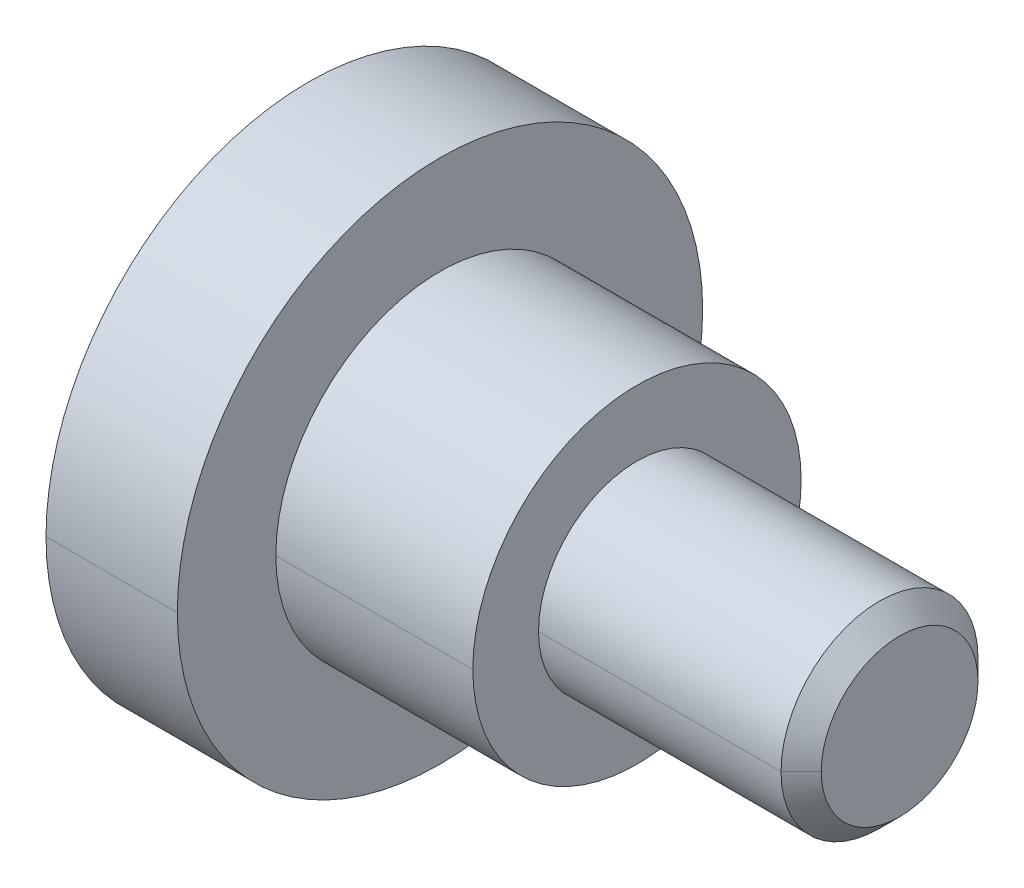
ISO-10303-21;
HEADER;
FILE_DESCRIPTION(('STEP AP214'),'2;1');
FILE_NAME('part.step','',(''),(''),'','','');
FILE_SCHEMA(('AUTOMOTIVE_DESIGN { 1 0 10303 214 1 1 1 1 }'));
ENDSEC;
DATA;
#1=APPLICATION_CONTEXT('core data for automotive mechanical design processes');
#2=APPLICATION_PROTOCOL_DEFINITION('international standard','automotive_design',2000,#1);
#3=PRODUCT_CONTEXT('',#1,'mechanical');
#4=PRODUCT('Part','Part','',(#3));
#5=PRODUCT_RELATED_PRODUCT_CATEGORY('part','',(#4));
#6=PRODUCT_DEFINITION_FORMATION('','',#4);
#7=PRODUCT_DEFINITION_CONTEXT('part definition',#1,'design');
#8=PRODUCT_DEFINITION('design','',#6,#7);
#9=PRODUCT_DEFINITION_SHAPE('','',#8);
#10=(LENGTH_UNIT() NAMED_UNIT(*) SI_UNIT(.MILLI.,.METRE.));
#11=(NAMED_UNIT(*) PLANE_ANGLE_UNIT() SI_UNIT($,.RADIAN.));
#12=(NAMED_UNIT(*) SI_UNIT($,.STERADIAN.) SOLID_ANGLE_UNIT());
#13=UNCERTAINTY_MEASURE_WITH_UNIT(LENGTH_MEASURE(1.E-05),#10,'distance_accuracy_value','');
#14=(GEOMETRIC_REPRESENTATION_CONTEXT(3) GLOBAL_UNCERTAINTY_ASSIGNED_CONTEXT((#13)) GLOBAL_UNIT_ASSIGNED_CONTEXT((#10,
#11,#12)) REPRESENTATION_CONTEXT('',''));
#15=CARTESIAN_POINT('',(0.,0.,0.));
#16=DIRECTION('',(0.,0.,1.));
#17=DIRECTION('',(1.,0.,0.));
#18=AXIS2_PLACEMENT_3D('',#15,#16,#17);
#19=CARTESIAN_POINT('',(-3.,0.,0.));
#20=DIRECTION('',(-1.,0.,0.));
#21=DIRECTION('',(0.,1.,0.));
#22=AXIS2_PLACEMENT_3D('',#19,#20,#21);
#23=CONICAL_SURFACE('',#22,1.,1.0471975512);
#24=DIRECTION('',(-0.499999999997054,0.,-0.86602540378614));
#25=VECTOR('',#24,1.);
#26=CARTESIAN_POINT('',(-2.42264973081491,0.,0.));
#27=LINE('',#26,#25);
#28=CARTESIAN_POINT('',(-2.4226497308104,0.,0.));
#29=VERTEX_POINT('',#28);
#30=CARTESIAN_POINT('',(-3.,0.,-1.));
#31=VERTEX_POINT('',#30);
#32=EDGE_CURVE('E11',#29,#31,#27,.T.);
#33=ORIENTED_EDGE('',*,*,#32,.T.);
#34=CARTESIAN_POINT('',(-3.,0.,0.));
#35=DIRECTION('',(-1.,0.,0.));
#36=DIRECTION('',(0.,0.,1.));
#37=AXIS2_PLACEMENT_3D('',#34,#35,#36);
#38=CIRCLE('',#37,1.);
#39=CARTESIAN_POINT('',(-3.,-0.866025403784422,-0.500000000000029));
#40=VERTEX_POINT('',#39);
#41=EDGE_CURVE('E24',#31,#40,#38,.T.);
#42=ORIENTED_EDGE('',*,*,#41,.T.);
#43=CARTESIAN_POINT('',(-3.,0.,0.));
#44=DIRECTION('',(-1.,0.,0.));
#45=DIRECTION('',(0.,0.,1.));
#46=AXIS2_PLACEMENT_3D('',#43,#44,#45);
#47=CIRCLE('',#46,1.);
#48=CARTESIAN_POINT('',(-3.,-0.866025403784422,0.500000000000029));
#49=VERTEX_POINT('',#48);
#50=EDGE_CURVE('E373',#40,#49,#47,.T.);
#51=ORIENTED_EDGE('',*,*,#50,.T.);
#52=CARTESIAN_POINT('',(-3.,0.,0.));
#53=DIRECTION('',(-1.,0.,0.));
#54=DIRECTION('',(0.,0.,1.));
#55=AXIS2_PLACEMENT_3D('',#52,#53,#54);
#56=CIRCLE('',#55,1.);
#57=CARTESIAN_POINT('',(-3.,0.,1.));
#58=VERTEX_POINT('',#57);
#59=EDGE_CURVE('E369',#49,#58,#56,.T.);
#60=ORIENTED_EDGE('',*,*,#59,.T.);
#61=DIRECTION('',(-0.499999999997054,0.,0.86602540378614));
#62=VECTOR('',#61,1.);
#63=CARTESIAN_POINT('',(-2.42264973081491,0.,0.));
#64=LINE('',#63,#62);
#65=EDGE_CURVE('E364',#29,#58,#64,.T.);
#66=ORIENTED_EDGE('',*,*,#65,.F.);
#67=EDGE_LOOP('',(#33,#42,#51,#60,#66));
#68=FACE_BOUND('',#67,.T.);
#69=ADVANCED_FACE('F16',(#68),#23,.F.);
#70=CARTESIAN_POINT('',(-3.,0.,0.));
#71=DIRECTION('',(-1.,0.,0.));
#72=DIRECTION('',(0.,-1.,0.));
#73=AXIS2_PLACEMENT_3D('',#70,#71,#72);
#74=CONICAL_SURFACE('',#73,1.,1.0471975512);
#75=ORIENTED_EDGE('',*,*,#65,.T.);
#76=CARTESIAN_POINT('',(-3.,0.,0.));
#77=DIRECTION('',(-1.,0.,0.));
#78=DIRECTION('',(0.,0.,1.));
#79=AXIS2_PLACEMENT_3D('',#76,#77,#78);
#80=CIRCLE('',#79,1.);
#81=CARTESIAN_POINT('',(-3.,0.866025403784422,0.500000000000029));
#82=VERTEX_POINT('',#81);
#83=EDGE_CURVE('E360',#58,#82,#80,.T.);
#84=ORIENTED_EDGE('',*,*,#83,.T.);
#85=CARTESIAN_POINT('',(-3.,0.,0.));
#86=DIRECTION('',(-1.,0.,0.));
#87=DIRECTION('',(0.,0.,1.));
#88=AXIS2_PLACEMENT_3D('',#85,#86,#87);
#89=CIRCLE('',#88,1.);
#90=CARTESIAN_POINT('',(-3.,0.866025403784422,-0.500000000000029));
#91=VERTEX_POINT('',#90);
#92=EDGE_CURVE('E356',#82,#91,#89,.T.);
#93=ORIENTED_EDGE('',*,*,#92,.T.);
#94=CARTESIAN_POINT('',(-3.,0.,0.));
#95=DIRECTION('',(-1.,0.,0.));
#96=DIRECTION('',(0.,0.,1.));
#97=AXIS2_PLACEMENT_3D('',#94,#95,#96);
#98=CIRCLE('',#97,1.);
#99=EDGE_CURVE('E352',#91,#31,#98,.T.);
#100=ORIENTED_EDGE('',*,*,#99,.T.);
#101=ORIENTED_EDGE('',*,*,#32,.F.);
#102=EDGE_LOOP('',(#75,#84,#93,#100,#101));
#103=FACE_BOUND('',#102,.T.);
#104=ADVANCED_FACE('F400',(#103),#74,.F.);
#105=CARTESIAN_POINT('',(-3.,0.,0.));
#106=DIRECTION('',(-1.,0.,0.));
#107=DIRECTION('',(0.,0.,1.));
#108=AXIS2_PLACEMENT_3D('',#105,#106,#107);
#109=PLANE('',#108);
#110=DIRECTION('',(0.,-1.,0.));
#111=VECTOR('',#110,1.);
#112=CARTESIAN_POINT('',(-3.,0.57735026918963,-1.));
#113=LINE('',#112,#111);
#114=CARTESIAN_POINT('',(-3.,0.57735026918963,-1.));
#115=VERTEX_POINT('',#114);
#116=EDGE_CURVE('E347',#115,#31,#113,.T.);
#117=ORIENTED_EDGE('',*,*,#116,.T.);
#118=ORIENTED_EDGE('',*,*,#99,.F.);
#119=DIRECTION('',(0.,-0.500000000000029,-0.866025403784422));
#120=VECTOR('',#119,1.);
#121=CARTESIAN_POINT('',(-3.,1.1547005383793,0.));
#122=LINE('',#121,#120);
#123=EDGE_CURVE('E343',#91,#115,#122,.T.);
#124=ORIENTED_EDGE('',*,*,#123,.T.);
#125=EDGE_LOOP('',(#117,#118,#124));
#126=FACE_BOUND('',#125,.T.);
#127=ADVANCED_FACE('F414',(#126),#109,.T.);
#128=CARTESIAN_POINT('',(-3.,1.1547005383793,0.));
#129=DIRECTION('',(0.,0.866025403784422,-0.500000000000029));
#130=DIRECTION('',(0.,0.500000000000029,0.866025403784422));
#131=AXIS2_PLACEMENT_3D('',#128,#129,#130);
#132=PLANE('',#131);
#133=DIRECTION('',(0.,-0.500000000000029,-0.866025403784422));
#134=VECTOR('',#133,1.);
#135=CARTESIAN_POINT('',(-5.,1.1547005383793,0.));
#136=LINE('',#135,#134);
#137=CARTESIAN_POINT('',(-5.,1.1547005383793,0.));
#138=VERTEX_POINT('',#137);
#139=CARTESIAN_POINT('',(-5.,0.57735026918963,-1.));
#140=VERTEX_POINT('',#139);
#141=EDGE_CURVE('E339',#138,#140,#136,.T.);
#142=ORIENTED_EDGE('',*,*,#141,.T.);
#143=DIRECTION('',(-1.,0.,0.));
#144=VECTOR('',#143,1.);
#145=CARTESIAN_POINT('',(-3.,0.57735026918963,-1.));
#146=LINE('',#145,#144);
#147=EDGE_CURVE('E334',#115,#140,#146,.T.);
#148=ORIENTED_EDGE('',*,*,#147,.F.);
#149=ORIENTED_EDGE('',*,*,#123,.F.);
#150=DIRECTION('',(0.,-0.500000000000029,-0.866025403784422));
#151=VECTOR('',#150,1.);
#152=CARTESIAN_POINT('',(-3.,1.1547005383793,0.));
#153=LINE('',#152,#151);
#154=CARTESIAN_POINT('',(-3.,1.1547005383793,0.));
#155=VERTEX_POINT('',#154);
#156=EDGE_CURVE('E329',#155,#91,#153,.T.);
#157=ORIENTED_EDGE('',*,*,#156,.F.);
#158=DIRECTION('',(-1.,0.,0.));
#159=VECTOR('',#158,1.);
#160=CARTESIAN_POINT('',(-3.,1.1547005383793,0.));
#161=LINE('',#160,#159);
#162=EDGE_CURVE('E325',#155,#138,#161,.T.);
#163=ORIENTED_EDGE('',*,*,#162,.T.);
#164=EDGE_LOOP('',(#142,#148,#149,#157,#163));
#165=FACE_BOUND('',#164,.T.);
#166=ADVANCED_FACE('F410',(#165),#132,.F.);
#167=CARTESIAN_POINT('',(-3.,0.57735026918963,1.));
#168=DIRECTION('',(0.,0.866025403784422,0.500000000000029));
#169=DIRECTION('',(0.,-0.500000000000029,0.866025403784422));
#170=AXIS2_PLACEMENT_3D('',#167,#168,#169);
#171=PLANE('',#170);
#172=DIRECTION('',(0.,0.500000000000029,-0.866025403784422));
#173=VECTOR('',#172,1.);
#174=CARTESIAN_POINT('',(-5.,0.57735026918963,1.));
#175=LINE('',#174,#173);
#176=CARTESIAN_POINT('',(-5.,0.57735026918963,1.));
#177=VERTEX_POINT('',#176);
#178=EDGE_CURVE('E320',#177,#138,#175,.T.);
#179=ORIENTED_EDGE('',*,*,#178,.T.);
#180=ORIENTED_EDGE('',*,*,#162,.F.);
#181=DIRECTION('',(0.,0.500000000000029,-0.866025403784422));
#182=VECTOR('',#181,1.);
#183=CARTESIAN_POINT('',(-3.,0.57735026918963,1.));
#184=LINE('',#183,#182);
#185=EDGE_CURVE('E315',#82,#155,#184,.T.);
#186=ORIENTED_EDGE('',*,*,#185,.F.);
#187=DIRECTION('',(0.,0.500000000000029,-0.866025403784422));
#188=VECTOR('',#187,1.);
#189=CARTESIAN_POINT('',(-3.,0.57735026918963,1.));
#190=LINE('',#189,#188);
#191=CARTESIAN_POINT('',(-3.,0.57735026918963,1.));
#192=VERTEX_POINT('',#191);
#193=EDGE_CURVE('E310',#192,#82,#190,.T.);
#194=ORIENTED_EDGE('',*,*,#193,.F.);
#195=DIRECTION('',(-1.,0.,0.));
#196=VECTOR('',#195,1.);
#197=CARTESIAN_POINT('',(-3.,0.57735026918963,1.));
#198=LINE('',#197,#196);
#199=EDGE_CURVE('E306',#192,#177,#198,.T.);
#200=ORIENTED_EDGE('',*,*,#199,.T.);
#201=EDGE_LOOP('',(#179,#180,#186,#194,#200));
#202=FACE_BOUND('',#201,.T.);
#203=ADVANCED_FACE('F404',(#202),#171,.F.);
#204=CARTESIAN_POINT('',(-3.,-0.57735026918963,1.));
#205=DIRECTION('',(0.,0.,1.));
#206=DIRECTION('',(1.,0.,0.));
#207=AXIS2_PLACEMENT_3D('',#204,#205,#206);
#208=PLANE('',#207);
#209=DIRECTION('',(0.,1.,0.));
#210=VECTOR('',#209,1.);
#211=CARTESIAN_POINT('',(-5.,-0.57735026918963,1.));
#212=LINE('',#211,#210);
#213=CARTESIAN_POINT('',(-5.,-0.57735026918963,1.));
#214=VERTEX_POINT('',#213);
#215=EDGE_CURVE('E301',#214,#177,#212,.T.);
#216=ORIENTED_EDGE('',*,*,#215,.T.);
#217=ORIENTED_EDGE('',*,*,#199,.F.);
#218=DIRECTION('',(0.,1.,0.));
#219=VECTOR('',#218,1.);
#220=CARTESIAN_POINT('',(-3.,-0.57735026918963,1.));
#221=LINE('',#220,#219);
#222=EDGE_CURVE('E296',#58,#192,#221,.T.);
#223=ORIENTED_EDGE('',*,*,#222,.F.);
#224=DIRECTION('',(0.,1.,0.));
#225=VECTOR('',#224,1.);
#226=CARTESIAN_POINT('',(-3.,-0.57735026918963,1.));
#227=LINE('',#226,#225);
#228=CARTESIAN_POINT('',(-3.,-0.57735026918963,1.));
#229=VERTEX_POINT('',#228);
#230=EDGE_CURVE('E291',#229,#58,#227,.T.);
#231=ORIENTED_EDGE('',*,*,#230,.F.);
#232=DIRECTION('',(-1.,0.,0.));
#233=VECTOR('',#232,1.);
#234=CARTESIAN_POINT('',(-3.,-0.57735026918963,1.));
#235=LINE('',#234,#233);
#236=EDGE_CURVE('E287',#229,#214,#235,.T.);
#237=ORIENTED_EDGE('',*,*,#236,.T.);
#238=EDGE_LOOP('',(#216,#217,#223,#231,#237));
#239=FACE_BOUND('',#238,.T.);
#240=ADVANCED_FACE('F430',(#239),#208,.F.);
#241=CARTESIAN_POINT('',(-3.,-1.1547005383793,0.));
#242=DIRECTION('',(0.,-0.866025403784422,0.500000000000029));
#243=DIRECTION('',(0.,-0.500000000000029,-0.866025403784422));
#244=AXIS2_PLACEMENT_3D('',#241,#242,#243);
#245=PLANE('',#244);
#246=DIRECTION('',(0.,0.500000000000029,0.866025403784422));
#247=VECTOR('',#246,1.);
#248=CARTESIAN_POINT('',(-5.,-1.1547005383793,0.));
#249=LINE('',#248,#247);
#250=CARTESIAN_POINT('',(-5.,-1.1547005383793,0.));
#251=VERTEX_POINT('',#250);
#252=EDGE_CURVE('E282',#251,#214,#249,.T.);
#253=ORIENTED_EDGE('',*,*,#252,.T.);
#254=ORIENTED_EDGE('',*,*,#236,.F.);
#255=DIRECTION('',(0.,0.500000000000029,0.866025403784422));
#256=VECTOR('',#255,1.);
#257=CARTESIAN_POINT('',(-3.,-1.1547005383793,0.));
#258=LINE('',#257,#256);
#259=EDGE_CURVE('E277',#49,#229,#258,.T.);
#260=ORIENTED_EDGE('',*,*,#259,.F.);
#261=DIRECTION('',(0.,0.500000000000029,0.866025403784422));
#262=VECTOR('',#261,1.);
#263=CARTESIAN_POINT('',(-3.,-1.1547005383793,0.));
#264=LINE('',#263,#262);
#265=CARTESIAN_POINT('',(-3.,-1.1547005383793,0.));
#266=VERTEX_POINT('',#265);
#267=EDGE_CURVE('E272',#266,#49,#264,.T.);
#268=ORIENTED_EDGE('',*,*,#267,.F.);
#269=DIRECTION('',(-1.,0.,0.));
#270=VECTOR('',#269,1.);
#271=CARTESIAN_POINT('',(-3.,-1.1547005383793,0.));
#272=LINE('',#271,#270);
#273=EDGE_CURVE('E268',#266,#251,#272,.T.);
#274=ORIENTED_EDGE('',*,*,#273,.T.);
#275=EDGE_LOOP('',(#253,#254,#260,#268,#274));
#276=FACE_BOUND('',#275,.T.);
#277=ADVANCED_FACE('F387',(#276),#245,.F.);
#278=CARTESIAN_POINT('',(-3.,-0.57735026918963,-1.));
#279=DIRECTION('',(0.,-0.866025403784422,-0.500000000000029));
#280=DIRECTION('',(0.,0.500000000000029,-0.866025403784422));
#281=AXIS2_PLACEMENT_3D('',#278,#279,#280);
#282=PLANE('',#281);
#283=DIRECTION('',(0.,-0.500000000000029,0.866025403784422));
#284=VECTOR('',#283,1.);
#285=CARTESIAN_POINT('',(-5.,-0.57735026918963,-1.));
#286=LINE('',#285,#284);
#287=CARTESIAN_POINT('',(-5.,-0.57735026918963,-1.));
#288=VERTEX_POINT('',#287);
#289=EDGE_CURVE('E263',#288,#251,#286,.T.);
#290=ORIENTED_EDGE('',*,*,#289,.T.);
#291=ORIENTED_EDGE('',*,*,#273,.F.);
#292=DIRECTION('',(0.,-0.500000000000029,0.866025403784422));
#293=VECTOR('',#292,1.);
#294=CARTESIAN_POINT('',(-3.,-0.57735026918963,-1.));
#295=LINE('',#294,#293);
#296=EDGE_CURVE('E258',#40,#266,#295,.T.);
#297=ORIENTED_EDGE('',*,*,#296,.F.);
#298=DIRECTION('',(0.,-0.500000000000029,0.866025403784422));
#299=VECTOR('',#298,1.);
#300=CARTESIAN_POINT('',(-3.,-0.57735026918963,-1.));
#301=LINE('',#300,#299);
#302=CARTESIAN_POINT('',(-3.,-0.57735026918963,-1.));
#303=VERTEX_POINT('',#302);
#304=EDGE_CURVE('E253',#303,#40,#301,.T.);
#305=ORIENTED_EDGE('',*,*,#304,.F.);
#306=DIRECTION('',(-1.,0.,0.));
#307=VECTOR('',#306,1.);
#308=CARTESIAN_POINT('',(-3.,-0.57735026918963,-1.));
#309=LINE('',#308,#307);
#310=EDGE_CURVE('E249',#303,#288,#309,.T.);
#311=ORIENTED_EDGE('',*,*,#310,.T.);
#312=EDGE_LOOP('',(#290,#291,#297,#305,#311));
#313=FACE_BOUND('',#312,.T.);
#314=ADVANCED_FACE('F422',(#313),#282,.F.);
#315=CARTESIAN_POINT('',(-3.,0.57735026918963,-1.));
#316=DIRECTION('',(0.,0.,-1.));
#317=DIRECTION('',(-1.,0.,0.));
#318=AXIS2_PLACEMENT_3D('',#315,#316,#317);
#319=PLANE('',#318);
#320=DIRECTION('',(0.,-1.,0.));
#321=VECTOR('',#320,1.);
#322=CARTESIAN_POINT('',(-5.,0.57735026918963,-1.));
#323=LINE('',#322,#321);
#324=EDGE_CURVE('E244',#140,#288,#323,.T.);
#325=ORIENTED_EDGE('',*,*,#324,.T.);
#326=ORIENTED_EDGE('',*,*,#310,.F.);
#327=DIRECTION('',(0.,-1.,0.));
#328=VECTOR('',#327,1.);
#329=CARTESIAN_POINT('',(-3.,0.57735026918963,-1.));
#330=LINE('',#329,#328);
#331=EDGE_CURVE('E239',#31,#303,#330,.T.);
#332=ORIENTED_EDGE('',*,*,#331,.F.);
#333=ORIENTED_EDGE('',*,*,#116,.F.);
#334=ORIENTED_EDGE('',*,*,#147,.T.);
#335=EDGE_LOOP('',(#325,#326,#332,#333,#334));
#336=FACE_BOUND('',#335,.T.);
#337=ADVANCED_FACE('F418',(#336),#319,.F.);
#338=CARTESIAN_POINT('',(-3.,0.,0.));
#339=DIRECTION('',(-1.,0.,0.));
#340=DIRECTION('',(0.,0.,1.));
#341=AXIS2_PLACEMENT_3D('',#338,#339,#340);
#342=PLANE('',#341);
#343=ORIENTED_EDGE('',*,*,#304,.T.);
#344=ORIENTED_EDGE('',*,*,#41,.F.);
#345=ORIENTED_EDGE('',*,*,#331,.T.);
#346=EDGE_LOOP('',(#343,#344,#345));
#347=FACE_BOUND('',#346,.T.);
#348=ADVANCED_FACE('F420',(#347),#342,.T.);
#349=CARTESIAN_POINT('',(-5.,0.,0.));
#350=DIRECTION('',(1.,0.,0.));
#351=DIRECTION('',(0.,0.,-1.));
#352=AXIS2_PLACEMENT_3D('',#349,#350,#351);
#353=PLANE('',#352);
#354=CARTESIAN_POINT('',(-5.,0.,0.));
#355=DIRECTION('',(1.,0.,0.));
#356=DIRECTION('',(0.,0.,-1.));
#357=AXIS2_PLACEMENT_3D('',#354,#355,#356);
#358=CIRCLE('',#357,4.);
#359=CARTESIAN_POINT('',(-5.,0.,-4.));
#360=VERTEX_POINT('',#359);
#361=CARTESIAN_POINT('',(-5.,0.,4.));
#362=VERTEX_POINT('',#361);
#363=EDGE_CURVE('E234',#360,#362,#358,.T.);
#364=ORIENTED_EDGE('',*,*,#363,.F.);
#365=CARTESIAN_POINT('',(-5.,0.,0.));
#366=DIRECTION('',(1.,0.,0.));
#367=DIRECTION('',(0.,0.,-1.));
#368=AXIS2_PLACEMENT_3D('',#365,#366,#367);
#369=CIRCLE('',#368,4.);
#370=EDGE_CURVE('E229',#362,#360,#369,.T.);
#371=ORIENTED_EDGE('',*,*,#370,.F.);
#372=EDGE_LOOP('',(#364,#371));
#373=FACE_BOUND('',#372,.T.);
#374=ORIENTED_EDGE('',*,*,#252,.F.);
#375=ORIENTED_EDGE('',*,*,#289,.F.);
#376=ORIENTED_EDGE('',*,*,#324,.F.);
#377=ORIENTED_EDGE('',*,*,#141,.F.);
#378=ORIENTED_EDGE('',*,*,#178,.F.);
#379=ORIENTED_EDGE('',*,*,#215,.F.);
#380=EDGE_LOOP('',(#374,#375,#376,#377,#378,#379));
#381=FACE_BOUND('',#380,.T.);
#382=ADVANCED_FACE('F428',(#373,#381),#353,.F.);
#383=CARTESIAN_POINT('',(4.,0.,0.));
#384=DIRECTION('',(-1.,0.,0.));
#385=DIRECTION('',(0.,1.,0.));
#386=AXIS2_PLACEMENT_3D('',#383,#384,#385);
#387=CYLINDRICAL_SURFACE('',#386,4.);
#388=ORIENTED_EDGE('',*,*,#370,.T.);
#389=DIRECTION('',(-1.,0.,0.));
#390=VECTOR('',#389,1.);
#391=CARTESIAN_POINT('',(-3.,0.,-4.));
#392=LINE('',#391,#390);
#393=CARTESIAN_POINT('',(-3.,0.,-4.));
#394=VERTEX_POINT('',#393);
#395=EDGE_CURVE('E224',#394,#360,#392,.T.);
#396=ORIENTED_EDGE('',*,*,#395,.F.);
#397=CARTESIAN_POINT('',(-3.,0.,0.));
#398=DIRECTION('',(1.,0.,0.));
#399=DIRECTION('',(0.,0.,-1.));
#400=AXIS2_PLACEMENT_3D('',#397,#398,#399);
#401=CIRCLE('',#400,4.);
#402=CARTESIAN_POINT('',(-3.,0.,4.));
#403=VERTEX_POINT('',#402);
#404=EDGE_CURVE('E219',#403,#394,#401,.T.);
#405=ORIENTED_EDGE('',*,*,#404,.F.);
#406=DIRECTION('',(-1.,0.,0.));
#407=VECTOR('',#406,1.);
#408=CARTESIAN_POINT('',(-3.,0.,4.));
#409=LINE('',#408,#407);
#410=EDGE_CURVE('E214',#403,#362,#409,.T.);
#411=ORIENTED_EDGE('',*,*,#410,.T.);
#412=EDGE_LOOP('',(#388,#396,#405,#411));
#413=FACE_BOUND('',#412,.T.);
#414=ADVANCED_FACE('F507',(#413),#387,.T.);
#415=CARTESIAN_POINT('',(4.,0.,0.));
#416=DIRECTION('',(-1.,0.,0.));
#417=DIRECTION('',(0.,-1.,0.));
#418=AXIS2_PLACEMENT_3D('',#415,#416,#417);
#419=CYLINDRICAL_SURFACE('',#418,4.);
#420=CARTESIAN_POINT('',(-3.,0.,0.));
#421=DIRECTION('',(1.,0.,0.));
#422=DIRECTION('',(0.,0.,-1.));
#423=AXIS2_PLACEMENT_3D('',#420,#421,#422);
#424=CIRCLE('',#423,4.);
#425=EDGE_CURVE('E209',#394,#403,#424,.T.);
#426=ORIENTED_EDGE('',*,*,#425,.F.);
#427=ORIENTED_EDGE('',*,*,#395,.T.);
#428=ORIENTED_EDGE('',*,*,#363,.T.);
#429=ORIENTED_EDGE('',*,*,#410,.F.);
#430=EDGE_LOOP('',(#426,#427,#428,#429));
#431=FACE_BOUND('',#430,.T.);
#432=ADVANCED_FACE('F517',(#431),#419,.T.);
#433=CARTESIAN_POINT('',(-3.,4.,0.));
#434=DIRECTION('',(-1.,0.,0.));
#435=DIRECTION('',(0.,0.,1.));
#436=AXIS2_PLACEMENT_3D('',#433,#434,#435);
#437=PLANE('',#436);
#438=CARTESIAN_POINT('',(-3.,0.,0.));
#439=DIRECTION('',(1.,0.,0.));
#440=DIRECTION('',(0.,0.,-1.));
#441=AXIS2_PLACEMENT_3D('',#438,#439,#440);
#442=CIRCLE('',#441,2.5);
#443=CARTESIAN_POINT('',(-3.,0.,-2.5));
#444=VERTEX_POINT('',#443);
#445=CARTESIAN_POINT('',(-3.,0.,2.5));
#446=VERTEX_POINT('',#445);
#447=EDGE_CURVE('E204',#444,#446,#442,.T.);
#448=ORIENTED_EDGE('',*,*,#447,.F.);
#449=CARTESIAN_POINT('',(-3.,0.,0.));
#450=DIRECTION('',(1.,0.,0.));
#451=DIRECTION('',(0.,0.,-1.));
#452=AXIS2_PLACEMENT_3D('',#449,#450,#451);
#453=CIRCLE('',#452,2.5);
#454=EDGE_CURVE('E199',#446,#444,#453,.T.);
#455=ORIENTED_EDGE('',*,*,#454,.F.);
#456=EDGE_LOOP('',(#448,#455));
#457=FACE_BOUND('',#456,.T.);
#458=ORIENTED_EDGE('',*,*,#425,.T.);
#459=ORIENTED_EDGE('',*,*,#404,.T.);
#460=EDGE_LOOP('',(#458,#459));
#461=FACE_BOUND('',#460,.T.);
#462=ADVANCED_FACE('F527',(#457,#461),#437,.F.);
#463=CARTESIAN_POINT('',(4.,0.,0.));
#464=DIRECTION('',(-1.,0.,0.));
#465=DIRECTION('',(0.,1.,0.));
#466=AXIS2_PLACEMENT_3D('',#463,#464,#465);
#467=CYLINDRICAL_SURFACE('',#466,2.5);
#468=ORIENTED_EDGE('',*,*,#454,.T.);
#469=DIRECTION('',(-1.,0.,0.));
#470=VECTOR('',#469,1.);
#471=CARTESIAN_POINT('',(0.,0.,-2.5));
#472=LINE('',#471,#470);
#473=CARTESIAN_POINT('',(0.,0.,-2.5));
#474=VERTEX_POINT('',#473);
#475=EDGE_CURVE('E194',#474,#444,#472,.T.);
#476=ORIENTED_EDGE('',*,*,#475,.F.);
#477=CARTESIAN_POINT('',(0.,0.,0.));
#478=DIRECTION('',(1.,0.,0.));
#479=DIRECTION('',(0.,0.,-1.));
#480=AXIS2_PLACEMENT_3D('',#477,#478,#479);
#481=CIRCLE('',#480,2.5);
#482=CARTESIAN_POINT('',(0.,0.,2.5));
#483=VERTEX_POINT('',#482);
#484=EDGE_CURVE('E189',#483,#474,#481,.T.);
#485=ORIENTED_EDGE('',*,*,#484,.F.);
#486=DIRECTION('',(-1.,0.,0.));
#487=VECTOR('',#486,1.);
#488=CARTESIAN_POINT('',(0.,0.,2.5));
#489=LINE('',#488,#487);
#490=EDGE_CURVE('E184',#483,#446,#489,.T.);
#491=ORIENTED_EDGE('',*,*,#490,.T.);
#492=EDGE_LOOP('',(#468,#476,#485,#491));
#493=FACE_BOUND('',#492,.T.);
#494=ADVANCED_FACE('F537',(#493),#467,.T.);
#495=CARTESIAN_POINT('',(4.,0.,0.));
#496=DIRECTION('',(-1.,0.,0.));
#497=DIRECTION('',(0.,-1.,0.));
#498=AXIS2_PLACEMENT_3D('',#495,#496,#497);
#499=CYLINDRICAL_SURFACE('',#498,2.5);
#500=CARTESIAN_POINT('',(0.,0.,0.));
#501=DIRECTION('',(1.,0.,0.));
#502=DIRECTION('',(0.,0.,-1.));
#503=AXIS2_PLACEMENT_3D('',#500,#501,#502);
#504=CIRCLE('',#503,2.5);
#505=EDGE_CURVE('E179',#474,#483,#504,.T.);
#506=ORIENTED_EDGE('',*,*,#505,.F.);
#507=ORIENTED_EDGE('',*,*,#475,.T.);
#508=ORIENTED_EDGE('',*,*,#447,.T.);
#509=ORIENTED_EDGE('',*,*,#490,.F.);
#510=EDGE_LOOP('',(#506,#507,#508,#509));
#511=FACE_BOUND('',#510,.T.);
#512=ADVANCED_FACE('F547',(#511),#499,.T.);
#513=CARTESIAN_POINT('',(0.,2.5,0.));
#514=DIRECTION('',(-1.,0.,0.));
#515=DIRECTION('',(0.,0.,1.));
#516=AXIS2_PLACEMENT_3D('',#513,#514,#515);
#517=PLANE('',#516);
#518=CARTESIAN_POINT('',(0.,0.,0.));
#519=DIRECTION('',(1.,0.,0.));
#520=DIRECTION('',(0.,0.,-1.));
#521=AXIS2_PLACEMENT_3D('',#518,#519,#520);
#522=CIRCLE('',#521,1.5);
#523=CARTESIAN_POINT('',(0.,0.,-1.5));
#524=VERTEX_POINT('',#523);
#525=CARTESIAN_POINT('',(0.,0.,1.5));
#526=VERTEX_POINT('',#525);
#527=EDGE_CURVE('E174',#524,#526,#522,.T.);
#528=ORIENTED_EDGE('',*,*,#527,.F.);
#529=CARTESIAN_POINT('',(0.,0.,0.));
#530=DIRECTION('',(1.,0.,0.));
#531=DIRECTION('',(0.,0.,-1.));
#532=AXIS2_PLACEMENT_3D('',#529,#530,#531);
#533=CIRCLE('',#532,1.5);
#534=EDGE_CURVE('E169',#526,#524,#533,.T.);
#535=ORIENTED_EDGE('',*,*,#534,.F.);
#536=EDGE_LOOP('',(#528,#535));
#537=FACE_BOUND('',#536,.T.);
#538=ORIENTED_EDGE('',*,*,#505,.T.);
#539=ORIENTED_EDGE('',*,*,#484,.T.);
#540=EDGE_LOOP('',(#538,#539));
#541=FACE_BOUND('',#540,.T.);
#542=ADVANCED_FACE('F557',(#537,#541),#517,.F.);
#543=CARTESIAN_POINT('',(4.,0.,0.));
#544=DIRECTION('',(-1.,0.,0.));
#545=DIRECTION('',(0.,1.,0.));
#546=AXIS2_PLACEMENT_3D('',#543,#544,#545);
#547=CYLINDRICAL_SURFACE('',#546,1.5);
#548=ORIENTED_EDGE('',*,*,#534,.T.);
#549=DIRECTION('',(-1.,0.,0.));
#550=VECTOR('',#549,1.);
#551=CARTESIAN_POINT('',(3.6935,0.,-1.5));
#552=LINE('',#551,#550);
#553=CARTESIAN_POINT('',(3.6935,0.,-1.5));
#554=VERTEX_POINT('',#553);
#555=EDGE_CURVE('E164',#554,#524,#552,.T.);
#556=ORIENTED_EDGE('',*,*,#555,.F.);
#557=CARTESIAN_POINT('',(3.6935,0.,0.));
#558=DIRECTION('',(1.,0.,0.));
#559=DIRECTION('',(0.,0.,-1.));
#560=AXIS2_PLACEMENT_3D('',#557,#558,#559);
#561=CIRCLE('',#560,1.5);
#562=CARTESIAN_POINT('',(3.6935,0.,1.5));
#563=VERTEX_POINT('',#562);
#564=EDGE_CURVE('E160',#563,#554,#561,.T.);
#565=ORIENTED_EDGE('',*,*,#564,.F.);
#566=DIRECTION('',(-1.,0.,0.));
#567=VECTOR('',#566,1.);
#568=CARTESIAN_POINT('',(3.6935,0.,1.5));
#569=LINE('',#568,#567);
#570=EDGE_CURVE('E148',#563,#526,#569,.T.);
#571=ORIENTED_EDGE('',*,*,#570,.T.);
#572=EDGE_LOOP('',(#548,#556,#565,#571));
#573=FACE_BOUND('',#572,.T.);
#574=ADVANCED_FACE('F567',(#573),#547,.T.);
#575=CARTESIAN_POINT('',(4.,0.,0.));
#576=DIRECTION('',(-1.,0.,0.));
#577=DIRECTION('',(0.,-1.,0.));
#578=AXIS2_PLACEMENT_3D('',#575,#576,#577);
#579=CYLINDRICAL_SURFACE('',#578,1.5);
#580=CARTESIAN_POINT('',(3.6935,0.,0.));
#581=DIRECTION('',(1.,0.,0.));
#582=DIRECTION('',(0.,0.,-1.));
#583=AXIS2_PLACEMENT_3D('',#580,#581,#582);
#584=CIRCLE('',#583,1.5);
#585=EDGE_CURVE('E136',#554,#563,#584,.T.);
#586=ORIENTED_EDGE('',*,*,#585,.F.);
#587=ORIENTED_EDGE('',*,*,#555,.T.);
#588=ORIENTED_EDGE('',*,*,#527,.T.);
#589=ORIENTED_EDGE('',*,*,#570,.F.);
#590=EDGE_LOOP('',(#586,#587,#588,#589));
#591=FACE_BOUND('',#590,.T.);
#592=ADVANCED_FACE('F577',(#591),#579,.T.);
#593=CARTESIAN_POINT('',(3.6935,0.,0.));
#594=DIRECTION('',(-1.,0.,0.));
#595=DIRECTION('',(0.,-1.,0.));
#596=AXIS2_PLACEMENT_3D('',#593,#594,#595);
#597=CONICAL_SURFACE('',#596,1.5,0.7853981634);
#598=CARTESIAN_POINT('',(4.,0.,0.));
#599=DIRECTION('',(1.,0.,0.));
#600=DIRECTION('',(0.,0.,-1.));
#601=AXIS2_PLACEMENT_3D('',#598,#599,#600);
#602=CIRCLE('',#601,1.1935);
#603=CARTESIAN_POINT('',(4.,0.,-1.1935));
#604=VERTEX_POINT('',#603);
#605=CARTESIAN_POINT('',(3.99999999999922,0.,1.19349999999922));
#606=VERTEX_POINT('',#605);
#607=EDGE_CURVE('E133',#604,#606,#602,.T.);
#608=ORIENTED_EDGE('',*,*,#607,.F.);
#609=DIRECTION('',(-0.707106781184743,0.,-0.707106781188352));
#610=VECTOR('',#609,1.);
#611=CARTESIAN_POINT('',(3.99999999999922,0.,-1.19349999999922));
#612=LINE('',#611,#610);
#613=EDGE_CURVE('E139',#604,#554,#612,.T.);
#614=ORIENTED_EDGE('',*,*,#613,.T.);
#615=ORIENTED_EDGE('',*,*,#585,.T.);
#616=DIRECTION('',(-0.707106781184743,0.,0.707106781188352));
#617=VECTOR('',#616,1.);
#618=CARTESIAN_POINT('',(3.99999999999922,0.,1.19349999999922));
#619=LINE('',#618,#617);
#620=EDGE_CURVE('E128',#606,#563,#619,.T.);
#621=ORIENTED_EDGE('',*,*,#620,.F.);
#622=EDGE_LOOP('',(#608,#614,#615,#621));
#623=FACE_BOUND('',#622,.T.);
#624=ADVANCED_FACE('F130',(#623),#597,.T.);
#625=CARTESIAN_POINT('',(3.6935,0.,0.));
#626=DIRECTION('',(-1.,0.,0.));
#627=DIRECTION('',(0.,1.,0.));
#628=AXIS2_PLACEMENT_3D('',#625,#626,#627);
#629=CONICAL_SURFACE('',#628,1.5,0.7853981634);
#630=ORIENTED_EDGE('',*,*,#564,.T.);
#631=ORIENTED_EDGE('',*,*,#613,.F.);
#632=CARTESIAN_POINT('',(4.,0.,0.));
#633=DIRECTION('',(1.,0.,0.));
#634=DIRECTION('',(0.,0.,-1.));
#635=AXIS2_PLACEMENT_3D('',#632,#633,#634);
#636=CIRCLE('',#635,1.1935);
#637=EDGE_CURVE('E140',#606,#604,#636,.T.);
#638=ORIENTED_EDGE('',*,*,#637,.F.);
#639=ORIENTED_EDGE('',*,*,#620,.T.);
#640=EDGE_LOOP('',(#630,#631,#638,#639));
#641=FACE_BOUND('',#640,.T.);
#642=ADVANCED_FACE('F143',(#641),#629,.T.);
#643=CARTESIAN_POINT('',(4.,1.1935,0.));
#644=DIRECTION('',(-1.,0.,0.));
#645=DIRECTION('',(0.,0.,1.));
#646=AXIS2_PLACEMENT_3D('',#643,#644,#645);
#647=PLANE('',#646);
#648=ORIENTED_EDGE('',*,*,#607,.T.);
#649=ORIENTED_EDGE('',*,*,#637,.T.);
#650=EDGE_LOOP('',(#648,#649));
#651=FACE_BOUND('',#650,.T.);
#652=ADVANCED_FACE('F146',(#651),#647,.F.);
#653=CARTESIAN_POINT('',(-3.,0.,0.));
#654=DIRECTION('',(-1.,0.,0.));
#655=DIRECTION('',(0.,0.,1.));
#656=AXIS2_PLACEMENT_3D('',#653,#654,#655);
#657=PLANE('',#656);
#658=ORIENTED_EDGE('',*,*,#267,.T.);
#659=ORIENTED_EDGE('',*,*,#50,.F.);
#660=ORIENTED_EDGE('',*,*,#296,.T.);
#661=EDGE_LOOP('',(#658,#659,#660));
#662=FACE_BOUND('',#661,.T.);
#663=ADVANCED_FACE('F390',(#662),#657,.T.);
#664=CARTESIAN_POINT('',(-3.,0.,0.));
#665=DIRECTION('',(-1.,0.,0.));
#666=DIRECTION('',(0.,0.,1.));
#667=AXIS2_PLACEMENT_3D('',#664,#665,#666);
#668=PLANE('',#667);
#669=ORIENTED_EDGE('',*,*,#230,.T.);
#670=ORIENTED_EDGE('',*,*,#59,.F.);
#671=ORIENTED_EDGE('',*,*,#259,.T.);
#672=EDGE_LOOP('',(#669,#670,#671));
#673=FACE_BOUND('',#672,.T.);
#674=ADVANCED_FACE('F391',(#673),#668,.T.);
#675=CARTESIAN_POINT('',(-3.,0.,0.));
#676=DIRECTION('',(-1.,0.,0.));
#677=DIRECTION('',(0.,0.,1.));
#678=AXIS2_PLACEMENT_3D('',#675,#676,#677);
#679=PLANE('',#678);
#680=ORIENTED_EDGE('',*,*,#193,.T.);
#681=ORIENTED_EDGE('',*,*,#83,.F.);
#682=ORIENTED_EDGE('',*,*,#222,.T.);
#683=EDGE_LOOP('',(#680,#681,#682));
#684=FACE_BOUND('',#683,.T.);
#685=ADVANCED_FACE('F396',(#684),#679,.T.);
#686=CARTESIAN_POINT('',(-3.,0.,0.));
#687=DIRECTION('',(-1.,0.,0.));
#688=DIRECTION('',(0.,0.,1.));
#689=AXIS2_PLACEMENT_3D('',#686,#687,#688);
#690=PLANE('',#689);
#691=ORIENTED_EDGE('',*,*,#156,.T.);
#692=ORIENTED_EDGE('',*,*,#92,.F.);
#693=ORIENTED_EDGE('',*,*,#185,.T.);
#694=EDGE_LOOP('',(#691,#692,#693));
#695=FACE_BOUND('',#694,.T.);
#696=ADVANCED_FACE('F407',(#695),#690,.T.);
#697=CLOSED_SHELL('',(#69,#104,#127,#166,#203,#240,#277,#314,#337,#348,#382,#414,#432,#462,#494,
#512,#542,#574,#592,#624,#642,#652,#663,#674,#685,#696));
#698=MANIFOLD_SOLID_BREP('B1',#697);
#699=ADVANCED_BREP_SHAPE_REPRESENTATION('',(#18,#698),#14);
#700=SHAPE_DEFINITION_REPRESENTATION(#9,#699);
ENDSEC;
END-ISO-10303-21;
